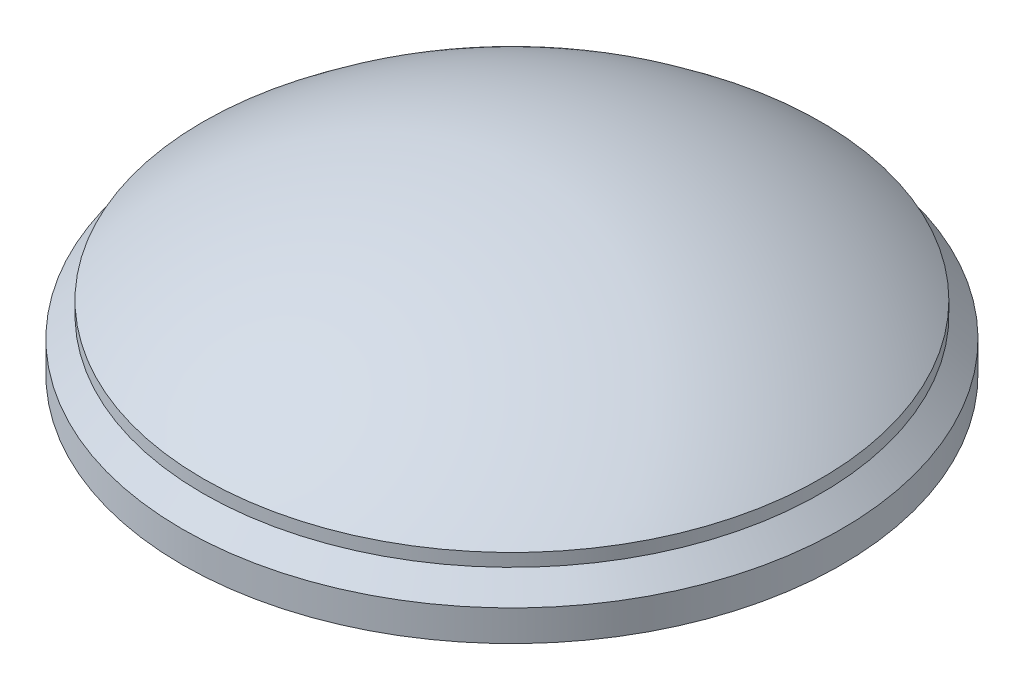
ISO-10303-21;
HEADER;
FILE_DESCRIPTION(('STEP AP214'),'2;1');
FILE_NAME('part.step','',(''),(''),'','','');
FILE_SCHEMA(('AUTOMOTIVE_DESIGN { 1 0 10303 214 1 1 1 1 }'));
ENDSEC;
DATA;
#1=APPLICATION_CONTEXT('core data for automotive mechanical design processes');
#2=APPLICATION_PROTOCOL_DEFINITION('international standard','automotive_design',2000,#1);
#3=PRODUCT_CONTEXT('',#1,'mechanical');
#4=PRODUCT('Part','Part','',(#3));
#5=PRODUCT_RELATED_PRODUCT_CATEGORY('part','',(#4));
#6=PRODUCT_DEFINITION_FORMATION('','',#4);
#7=PRODUCT_DEFINITION_CONTEXT('part definition',#1,'design');
#8=PRODUCT_DEFINITION('design','',#6,#7);
#9=PRODUCT_DEFINITION_SHAPE('','',#8);
#10=(LENGTH_UNIT() NAMED_UNIT(*) SI_UNIT(.MILLI.,.METRE.));
#11=(NAMED_UNIT(*) PLANE_ANGLE_UNIT() SI_UNIT($,.RADIAN.));
#12=(NAMED_UNIT(*) SI_UNIT($,.STERADIAN.) SOLID_ANGLE_UNIT());
#13=UNCERTAINTY_MEASURE_WITH_UNIT(LENGTH_MEASURE(1.E-05),#10,'distance_accuracy_value','');
#14=(GEOMETRIC_REPRESENTATION_CONTEXT(3) GLOBAL_UNCERTAINTY_ASSIGNED_CONTEXT((#13)) GLOBAL_UNIT_ASSIGNED_CONTEXT((#10,
#11,#12)) REPRESENTATION_CONTEXT('',''));
#15=CARTESIAN_POINT('',(0.,0.,0.));
#16=DIRECTION('',(0.,0.,1.));
#17=DIRECTION('',(1.,0.,0.));
#18=AXIS2_PLACEMENT_3D('',#15,#16,#17);
#19=CARTESIAN_POINT('',(0.,289.417577787743,0.));
#20=DIRECTION('',(0.,1.,0.));
#21=DIRECTION('',(0.,0.,1.));
#22=AXIS2_PLACEMENT_3D('',#19,#20,#21);
#23=CYLINDRICAL_SURFACE('',#22,64.);
#24=CARTESIAN_POINT('',(0.,16.,0.));
#25=DIRECTION('',(0.,1.,0.));
#26=DIRECTION('',(0.,0.,1.));
#27=AXIS2_PLACEMENT_3D('',#24,#25,#26);
#28=CIRCLE('',#27,64.);
#29=CARTESIAN_POINT('',(0.,16.,64.));
#30=VERTEX_POINT('',#29);
#31=EDGE_CURVE('E58',#30,#30,#28,.T.);
#32=ORIENTED_EDGE('',*,*,#31,.T.);
#33=EDGE_LOOP('',(#32));
#34=FACE_BOUND('',#33,.T.);
#35=CARTESIAN_POINT('',(0.,22.,0.));
#36=DIRECTION('',(0.,1.,0.));
#37=DIRECTION('',(0.,0.,1.));
#38=AXIS2_PLACEMENT_3D('',#35,#36,#37);
#39=CIRCLE('',#38,64.);
#40=CARTESIAN_POINT('',(0.,22.,64.));
#41=VERTEX_POINT('',#40);
#42=EDGE_CURVE('E10',#41,#41,#39,.T.);
#43=ORIENTED_EDGE('',*,*,#42,.F.);
#44=EDGE_LOOP('',(#43));
#45=FACE_BOUND('',#44,.T.);
#46=ADVANCED_FACE('F36',(#34,#45),#23,.T.);
#47=CARTESIAN_POINT('',(0.,26.,0.));
#48=DIRECTION('',(0.,-1.,0.));
#49=DIRECTION('',(0.,0.,-1.));
#50=AXIS2_PLACEMENT_3D('',#47,#48,#49);
#51=CONICAL_SURFACE('',#50,60.,0.785398163397454);
#52=ORIENTED_EDGE('',*,*,#42,.T.);
#53=EDGE_LOOP('',(#52));
#54=FACE_BOUND('',#53,.T.);
#55=CARTESIAN_POINT('',(0.,26.,0.));
#56=DIRECTION('',(0.,1.,0.));
#57=DIRECTION('',(0.,0.,1.));
#58=AXIS2_PLACEMENT_3D('',#55,#56,#57);
#59=CIRCLE('',#58,60.);
#60=CARTESIAN_POINT('',(0.,26.,60.));
#61=VERTEX_POINT('',#60);
#62=EDGE_CURVE('E42',#61,#61,#59,.T.);
#63=ORIENTED_EDGE('',*,*,#62,.F.);
#64=EDGE_LOOP('',(#63));
#65=FACE_BOUND('',#64,.T.);
#66=ADVANCED_FACE('F76',(#54,#65),#51,.T.);
#67=CARTESIAN_POINT('',(0.,289.417577787743,0.));
#68=DIRECTION('',(0.,1.,0.));
#69=DIRECTION('',(0.,0.,1.));
#70=AXIS2_PLACEMENT_3D('',#67,#68,#69);
#71=CYLINDRICAL_SURFACE('',#70,59.9999999999999);
#72=ORIENTED_EDGE('',*,*,#62,.T.);
#73=EDGE_LOOP('',(#72));
#74=FACE_BOUND('',#73,.T.);
#75=CARTESIAN_POINT('',(0.,28.4999999999999,0.));
#76=DIRECTION('',(0.,1.,0.));
#77=DIRECTION('',(0.,0.,1.));
#78=AXIS2_PLACEMENT_3D('',#75,#76,#77);
#79=CIRCLE('',#78,59.9999999999999);
#80=CARTESIAN_POINT('',(0.,28.4999999999999,59.9999999999999));
#81=VERTEX_POINT('',#80);
#82=EDGE_CURVE('E46',#81,#81,#79,.T.);
#83=ORIENTED_EDGE('',*,*,#82,.F.);
#84=EDGE_LOOP('',(#83));
#85=FACE_BOUND('',#84,.T.);
#86=ADVANCED_FACE('F80',(#74,#85),#71,.T.);
#87=CARTESIAN_POINT('',(0.,-45.1545993132812,0.));
#88=DIRECTION('',(0.,1.,0.));
#89=DIRECTION('',(-1.,0.,0.));
#90=AXIS2_PLACEMENT_3D('',#87,#88,#89);
#91=SPHERICAL_SURFACE('',#90,94.9999999999999);
#92=ORIENTED_EDGE('',*,*,#82,.T.);
#93=EDGE_LOOP('',(#92));
#94=FACE_BOUND('',#93,.T.);
#95=ADVANCED_FACE('F84',(#94),#91,.T.);
#96=CARTESIAN_POINT('',(0.,-45.1545993132812,0.));
#97=DIRECTION('',(0.,1.,0.));
#98=DIRECTION('',(-1.,0.,0.));
#99=AXIS2_PLACEMENT_3D('',#96,#97,#98);
#100=SPHERICAL_SURFACE('',#99,85.);
#101=CARTESIAN_POINT('',(0.,18.7906898017116,0.));
#102=DIRECTION('',(0.,1.,0.));
#103=DIRECTION('',(0.,0.,1.));
#104=AXIS2_PLACEMENT_3D('',#101,#102,#103);
#105=CIRCLE('',#104,56.);
#106=CARTESIAN_POINT('',(0.,18.7906898017116,56.));
#107=VERTEX_POINT('',#106);
#108=EDGE_CURVE('E50',#107,#107,#105,.T.);
#109=ORIENTED_EDGE('',*,*,#108,.F.);
#110=EDGE_LOOP('',(#109));
#111=FACE_BOUND('',#110,.T.);
#112=ADVANCED_FACE('F72',(#111),#100,.F.);
#113=CARTESIAN_POINT('',(0.,289.417577787743,0.));
#114=DIRECTION('',(0.,1.,0.));
#115=DIRECTION('',(0.,0.,1.));
#116=AXIS2_PLACEMENT_3D('',#113,#114,#115);
#117=CYLINDRICAL_SURFACE('',#116,56.);
#118=ORIENTED_EDGE('',*,*,#108,.T.);
#119=EDGE_LOOP('',(#118));
#120=FACE_BOUND('',#119,.T.);
#121=CARTESIAN_POINT('',(0.,16.,0.));
#122=DIRECTION('',(0.,1.,0.));
#123=DIRECTION('',(0.,0.,1.));
#124=AXIS2_PLACEMENT_3D('',#121,#122,#123);
#125=CIRCLE('',#124,56.);
#126=CARTESIAN_POINT('',(0.,16.,56.));
#127=VERTEX_POINT('',#126);
#128=EDGE_CURVE('E55',#127,#127,#125,.T.);
#129=ORIENTED_EDGE('',*,*,#128,.F.);
#130=EDGE_LOOP('',(#129));
#131=FACE_BOUND('',#130,.T.);
#132=ADVANCED_FACE('F66',(#120,#131),#117,.F.);
#133=CARTESIAN_POINT('',(-64.,16.,0.));
#134=DIRECTION('',(0.,-1.,0.));
#135=DIRECTION('',(0.,0.,-1.));
#136=AXIS2_PLACEMENT_3D('',#133,#134,#135);
#137=PLANE('',#136);
#138=ORIENTED_EDGE('',*,*,#128,.T.);
#139=EDGE_LOOP('',(#138));
#140=FACE_BOUND('',#139,.T.);
#141=ORIENTED_EDGE('',*,*,#31,.F.);
#142=EDGE_LOOP('',(#141));
#143=FACE_BOUND('',#142,.T.);
#144=ADVANCED_FACE('F64',(#140,#143),#137,.T.);
#145=CLOSED_SHELL('',(#46,#66,#86,#95,#112,#132,#144));
#146=MANIFOLD_SOLID_BREP('B2',#145);
#147=ADVANCED_BREP_SHAPE_REPRESENTATION('',(#18,#146),#14);
#148=SHAPE_DEFINITION_REPRESENTATION(#9,#147);
ENDSEC;
END-ISO-10303-21;
